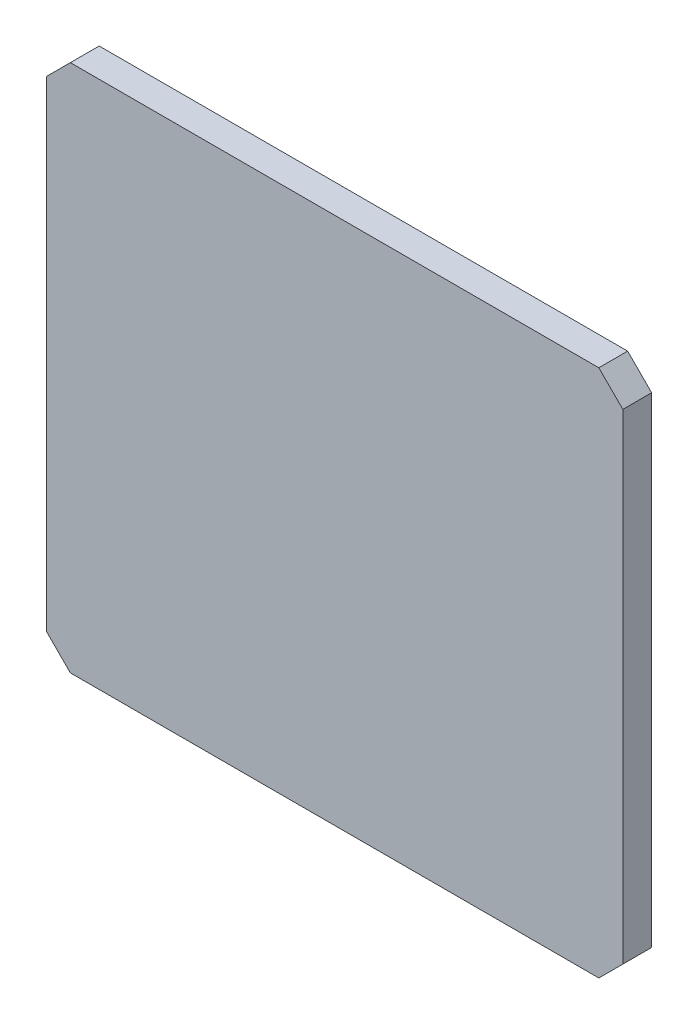
ISO-10303-21;
HEADER;
FILE_DESCRIPTION(('STEP AP214'),'2;1');
FILE_NAME('part.step','',(''),(''),'','','');
FILE_SCHEMA(('AUTOMOTIVE_DESIGN { 1 0 10303 214 1 1 1 1 }'));
ENDSEC;
DATA;
#1=APPLICATION_CONTEXT('core data for automotive mechanical design processes');
#2=APPLICATION_PROTOCOL_DEFINITION('international standard','automotive_design',2000,#1);
#3=PRODUCT_CONTEXT('',#1,'mechanical');
#4=PRODUCT('Part','Part','',(#3));
#5=PRODUCT_RELATED_PRODUCT_CATEGORY('part','',(#4));
#6=PRODUCT_DEFINITION_FORMATION('','',#4);
#7=PRODUCT_DEFINITION_CONTEXT('part definition',#1,'design');
#8=PRODUCT_DEFINITION('design','',#6,#7);
#9=PRODUCT_DEFINITION_SHAPE('','',#8);
#10=(LENGTH_UNIT() NAMED_UNIT(*) SI_UNIT(.MILLI.,.METRE.));
#11=(NAMED_UNIT(*) PLANE_ANGLE_UNIT() SI_UNIT($,.RADIAN.));
#12=(NAMED_UNIT(*) SI_UNIT($,.STERADIAN.) SOLID_ANGLE_UNIT());
#13=UNCERTAINTY_MEASURE_WITH_UNIT(LENGTH_MEASURE(1.E-05),#10,'distance_accuracy_value','');
#14=(GEOMETRIC_REPRESENTATION_CONTEXT(3) GLOBAL_UNCERTAINTY_ASSIGNED_CONTEXT((#13)) GLOBAL_UNIT_ASSIGNED_CONTEXT((#10,
#11,#12)) REPRESENTATION_CONTEXT('',''));
#15=CARTESIAN_POINT('',(0.,0.,0.));
#16=DIRECTION('',(0.,0.,1.));
#17=DIRECTION('',(1.,0.,0.));
#18=AXIS2_PLACEMENT_3D('',#15,#16,#17);
#19=CARTESIAN_POINT('',(-11.8671193399392,8.65417867435159,1.8));
#20=DIRECTION('',(1.,0.,0.));
#21=DIRECTION('',(0.,1.,0.));
#22=AXIS2_PLACEMENT_3D('',#19,#20,#21);
#23=PLANE('',#22);
#24=DIRECTION('',(0.,-1.,0.));
#25=VECTOR('',#24,1.);
#26=CARTESIAN_POINT('',(-11.8671193399392,8.65417867435159,0.));
#27=LINE('',#26,#25);
#28=CARTESIAN_POINT('',(-11.8671193399392,7.15417867435158,0.));
#29=VERTEX_POINT('',#28);
#30=CARTESIAN_POINT('',(-11.8671193399392,-22.8458213256484,0.));
#31=VERTEX_POINT('',#30);
#32=EDGE_CURVE('E130',#29,#31,#27,.T.);
#33=ORIENTED_EDGE('',*,*,#32,.T.);
#34=DIRECTION('',(0.,0.,1.));
#35=VECTOR('',#34,1.);
#36=CARTESIAN_POINT('',(-11.8671193399392,-22.8458213256484,1.8));
#37=LINE('',#36,#35);
#38=CARTESIAN_POINT('',(-11.8671193399392,-22.8458213256484,1.8));
#39=VERTEX_POINT('',#38);
#40=EDGE_CURVE('E152',#31,#39,#37,.T.);
#41=ORIENTED_EDGE('',*,*,#40,.T.);
#42=DIRECTION('',(0.,-1.,0.));
#43=VECTOR('',#42,1.);
#44=CARTESIAN_POINT('',(-11.8671193399392,8.65417867435159,1.8));
#45=LINE('',#44,#43);
#46=CARTESIAN_POINT('',(-11.8671193399392,7.15417867435158,1.8));
#47=VERTEX_POINT('',#46);
#48=EDGE_CURVE('E128',#47,#39,#45,.T.);
#49=ORIENTED_EDGE('',*,*,#48,.F.);
#50=DIRECTION('',(0.,0.,-1.));
#51=VECTOR('',#50,1.);
#52=CARTESIAN_POINT('',(-11.8671193399392,7.15417867435158,1.8));
#53=LINE('',#52,#51);
#54=EDGE_CURVE('E149',#47,#29,#53,.T.);
#55=ORIENTED_EDGE('',*,*,#54,.T.);
#56=EDGE_LOOP('',(#33,#41,#49,#55));
#57=FACE_BOUND('',#56,.T.);
#58=ADVANCED_FACE('F33',(#57),#23,.F.);
#59=CARTESIAN_POINT('',(-11.8671193399392,-24.3458213256484,1.8));
#60=DIRECTION('',(0.,1.,0.));
#61=DIRECTION('',(0.,0.,1.));
#62=AXIS2_PLACEMENT_3D('',#59,#60,#61);
#63=PLANE('',#62);
#64=DIRECTION('',(1.,0.,0.));
#65=VECTOR('',#64,1.);
#66=CARTESIAN_POINT('',(-11.8671193399392,-24.3458213256484,0.));
#67=LINE('',#66,#65);
#68=CARTESIAN_POINT('',(-10.3671193399392,-24.3458213256484,0.));
#69=VERTEX_POINT('',#68);
#70=CARTESIAN_POINT('',(22.6328806600608,-24.3458213256484,0.));
#71=VERTEX_POINT('',#70);
#72=EDGE_CURVE('E126',#69,#71,#67,.T.);
#73=ORIENTED_EDGE('',*,*,#72,.T.);
#74=DIRECTION('',(0.,0.,1.));
#75=VECTOR('',#74,1.);
#76=CARTESIAN_POINT('',(22.6328806600608,-24.3458213256484,1.8));
#77=LINE('',#76,#75);
#78=CARTESIAN_POINT('',(22.6328806600608,-24.3458213256484,1.8));
#79=VERTEX_POINT('',#78);
#80=EDGE_CURVE('E104',#71,#79,#77,.T.);
#81=ORIENTED_EDGE('',*,*,#80,.T.);
#82=DIRECTION('',(1.,0.,0.));
#83=VECTOR('',#82,1.);
#84=CARTESIAN_POINT('',(-11.8671193399392,-24.3458213256484,1.8));
#85=LINE('',#84,#83);
#86=CARTESIAN_POINT('',(-10.3671193399392,-24.3458213256484,1.8));
#87=VERTEX_POINT('',#86);
#88=EDGE_CURVE('E166',#87,#79,#85,.T.);
#89=ORIENTED_EDGE('',*,*,#88,.F.);
#90=DIRECTION('',(0.,0.,-1.));
#91=VECTOR('',#90,1.);
#92=CARTESIAN_POINT('',(-10.3671193399392,-24.3458213256484,1.8));
#93=LINE('',#92,#91);
#94=EDGE_CURVE('E109',#87,#69,#93,.T.);
#95=ORIENTED_EDGE('',*,*,#94,.T.);
#96=EDGE_LOOP('',(#73,#81,#89,#95));
#97=FACE_BOUND('',#96,.T.);
#98=ADVANCED_FACE('F171',(#97),#63,.F.);
#99=CARTESIAN_POINT('',(24.1328806600608,8.65417867435159,1.8));
#100=DIRECTION('',(-1.,0.,0.));
#101=DIRECTION('',(0.,-1.,0.));
#102=AXIS2_PLACEMENT_3D('',#99,#100,#101);
#103=PLANE('',#102);
#104=DIRECTION('',(0.,1.,0.));
#105=VECTOR('',#104,1.);
#106=CARTESIAN_POINT('',(24.1328806600608,8.65417867435159,1.8));
#107=LINE('',#106,#105);
#108=CARTESIAN_POINT('',(24.1328806600608,-22.8458213256484,1.8));
#109=VERTEX_POINT('',#108);
#110=CARTESIAN_POINT('',(24.1328806600608,7.15417867435157,1.8));
#111=VERTEX_POINT('',#110);
#112=EDGE_CURVE('E118',#109,#111,#107,.T.);
#113=ORIENTED_EDGE('',*,*,#112,.F.);
#114=DIRECTION('',(0.,0.,-1.));
#115=VECTOR('',#114,1.);
#116=CARTESIAN_POINT('',(24.1328806600608,-22.8458213256484,1.8));
#117=LINE('',#116,#115);
#118=CARTESIAN_POINT('',(24.1328806600608,-22.8458213256484,0.));
#119=VERTEX_POINT('',#118);
#120=EDGE_CURVE('E103',#109,#119,#117,.T.);
#121=ORIENTED_EDGE('',*,*,#120,.T.);
#122=DIRECTION('',(0.,1.,0.));
#123=VECTOR('',#122,1.);
#124=CARTESIAN_POINT('',(24.1328806600608,8.65417867435159,0.));
#125=LINE('',#124,#123);
#126=CARTESIAN_POINT('',(24.1328806600608,7.15417867435157,0.));
#127=VERTEX_POINT('',#126);
#128=EDGE_CURVE('E116',#119,#127,#125,.T.);
#129=ORIENTED_EDGE('',*,*,#128,.T.);
#130=DIRECTION('',(0.,0.,1.));
#131=VECTOR('',#130,1.);
#132=CARTESIAN_POINT('',(24.1328806600608,7.15417867435157,1.8));
#133=LINE('',#132,#131);
#134=EDGE_CURVE('E120',#127,#111,#133,.T.);
#135=ORIENTED_EDGE('',*,*,#134,.T.);
#136=EDGE_LOOP('',(#113,#121,#129,#135));
#137=FACE_BOUND('',#136,.T.);
#138=ADVANCED_FACE('F115',(#137),#103,.F.);
#139=CARTESIAN_POINT('',(-11.8671193399392,8.65417867435159,1.8));
#140=DIRECTION('',(0.,-1.,0.));
#141=DIRECTION('',(0.,0.,-1.));
#142=AXIS2_PLACEMENT_3D('',#139,#140,#141);
#143=PLANE('',#142);
#144=DIRECTION('',(-1.,0.,0.));
#145=VECTOR('',#144,1.);
#146=CARTESIAN_POINT('',(-11.8671193399392,8.65417867435159,1.8));
#147=LINE('',#146,#145);
#148=CARTESIAN_POINT('',(22.6328806600608,8.65417867435159,1.8));
#149=VERTEX_POINT('',#148);
#150=CARTESIAN_POINT('',(-10.3671193399392,8.65417867435159,1.8));
#151=VERTEX_POINT('',#150);
#152=EDGE_CURVE('E134',#149,#151,#147,.T.);
#153=ORIENTED_EDGE('',*,*,#152,.F.);
#154=DIRECTION('',(0.,0.,-1.));
#155=VECTOR('',#154,1.);
#156=CARTESIAN_POINT('',(22.6328806600608,8.65417867435159,1.8));
#157=LINE('',#156,#155);
#158=CARTESIAN_POINT('',(22.6328806600608,8.65417867435159,0.));
#159=VERTEX_POINT('',#158);
#160=EDGE_CURVE('E11',#149,#159,#157,.T.);
#161=ORIENTED_EDGE('',*,*,#160,.T.);
#162=DIRECTION('',(-1.,0.,0.));
#163=VECTOR('',#162,1.);
#164=CARTESIAN_POINT('',(-11.8671193399392,8.65417867435159,0.));
#165=LINE('',#164,#163);
#166=CARTESIAN_POINT('',(-10.3671193399392,8.65417867435159,0.));
#167=VERTEX_POINT('',#166);
#168=EDGE_CURVE('E125',#159,#167,#165,.T.);
#169=ORIENTED_EDGE('',*,*,#168,.T.);
#170=DIRECTION('',(0.,0.,1.));
#171=VECTOR('',#170,1.);
#172=CARTESIAN_POINT('',(-10.3671193399392,8.65417867435159,1.8));
#173=LINE('',#172,#171);
#174=EDGE_CURVE('E41',#167,#151,#173,.T.);
#175=ORIENTED_EDGE('',*,*,#174,.T.);
#176=EDGE_LOOP('',(#153,#161,#169,#175));
#177=FACE_BOUND('',#176,.T.);
#178=ADVANCED_FACE('F178',(#177),#143,.F.);
#179=CARTESIAN_POINT('',(0.,0.,1.8));
#180=DIRECTION('',(0.,0.,1.));
#181=DIRECTION('',(1.,0.,0.));
#182=AXIS2_PLACEMENT_3D('',#179,#180,#181);
#183=PLANE('',#182);
#184=ORIENTED_EDGE('',*,*,#88,.T.);
#185=DIRECTION('',(-0.707106781186548,-0.707106781186547,0.));
#186=VECTOR('',#185,1.);
#187=CARTESIAN_POINT('',(23.4893509928546,-23.4893509928546,1.8));
#188=LINE('',#187,#186);
#189=EDGE_CURVE('E147',#79,#109,#188,.F.);
#190=ORIENTED_EDGE('',*,*,#189,.T.);
#191=ORIENTED_EDGE('',*,*,#112,.T.);
#192=DIRECTION('',(0.707106781186548,-0.707106781186547,0.));
#193=VECTOR('',#192,1.);
#194=CARTESIAN_POINT('',(15.6435296672062,15.6435296672062,1.8));
#195=LINE('',#194,#193);
#196=EDGE_CURVE('E54',#111,#149,#195,.F.);
#197=ORIENTED_EDGE('',*,*,#196,.T.);
#198=ORIENTED_EDGE('',*,*,#152,.T.);
#199=DIRECTION('',(0.707106781186549,0.707106781186546,0.));
#200=VECTOR('',#199,1.);
#201=CARTESIAN_POINT('',(-9.51064900714536,9.5106490071454,1.8));
#202=LINE('',#201,#200);
#203=EDGE_CURVE('E142',#151,#47,#202,.F.);
#204=ORIENTED_EDGE('',*,*,#203,.T.);
#205=ORIENTED_EDGE('',*,*,#48,.T.);
#206=DIRECTION('',(-0.707106781186546,0.707106781186549,0.));
#207=VECTOR('',#206,1.);
#208=CARTESIAN_POINT('',(-17.3564703327938,-17.3564703327937,1.8));
#209=LINE('',#208,#207);
#210=EDGE_CURVE('E145',#39,#87,#209,.F.);
#211=ORIENTED_EDGE('',*,*,#210,.T.);
#212=EDGE_LOOP('',(#184,#190,#191,#197,#198,#204,#205,#211));
#213=FACE_BOUND('',#212,.T.);
#214=ADVANCED_FACE('F163',(#213),#183,.T.);
#215=CARTESIAN_POINT('',(0.,0.,0.));
#216=DIRECTION('',(0.,0.,1.));
#217=DIRECTION('',(1.,0.,0.));
#218=AXIS2_PLACEMENT_3D('',#215,#216,#217);
#219=PLANE('',#218);
#220=ORIENTED_EDGE('',*,*,#128,.F.);
#221=DIRECTION('',(0.707106781186548,0.707106781186547,0.));
#222=VECTOR('',#221,1.);
#223=CARTESIAN_POINT('',(24.1328806600608,-22.8458213256484,0.));
#224=LINE('',#223,#222);
#225=EDGE_CURVE('E99',#119,#71,#224,.F.);
#226=ORIENTED_EDGE('',*,*,#225,.T.);
#227=ORIENTED_EDGE('',*,*,#72,.F.);
#228=DIRECTION('',(0.707106781186546,-0.707106781186549,0.));
#229=VECTOR('',#228,1.);
#230=CARTESIAN_POINT('',(-10.3671193399392,-24.3458213256484,0.));
#231=LINE('',#230,#229);
#232=EDGE_CURVE('E110',#69,#31,#231,.F.);
#233=ORIENTED_EDGE('',*,*,#232,.T.);
#234=ORIENTED_EDGE('',*,*,#32,.F.);
#235=DIRECTION('',(-0.707106781186549,-0.707106781186546,0.));
#236=VECTOR('',#235,1.);
#237=CARTESIAN_POINT('',(-11.8671193399392,7.15417867435158,0.));
#238=LINE('',#237,#236);
#239=EDGE_CURVE('E119',#29,#167,#238,.F.);
#240=ORIENTED_EDGE('',*,*,#239,.T.);
#241=ORIENTED_EDGE('',*,*,#168,.F.);
#242=DIRECTION('',(-0.707106781186548,0.707106781186547,0.));
#243=VECTOR('',#242,1.);
#244=CARTESIAN_POINT('',(22.6328806600608,8.65417867435159,0.));
#245=LINE('',#244,#243);
#246=EDGE_CURVE('E124',#159,#127,#245,.F.);
#247=ORIENTED_EDGE('',*,*,#246,.T.);
#248=EDGE_LOOP('',(#220,#226,#227,#233,#234,#240,#241,#247));
#249=FACE_BOUND('',#248,.T.);
#250=ADVANCED_FACE('F122',(#249),#219,.F.);
#251=CARTESIAN_POINT('',(24.1328806600608,-22.8458213256484,1.8));
#252=DIRECTION('',(-0.707106781186547,0.707106781186548,0.));
#253=DIRECTION('',(0.,0.,-1.));
#254=AXIS2_PLACEMENT_3D('',#251,#252,#253);
#255=PLANE('',#254);
#256=ORIENTED_EDGE('',*,*,#189,.F.);
#257=ORIENTED_EDGE('',*,*,#80,.F.);
#258=ORIENTED_EDGE('',*,*,#225,.F.);
#259=ORIENTED_EDGE('',*,*,#120,.F.);
#260=EDGE_LOOP('',(#256,#257,#258,#259));
#261=FACE_BOUND('',#260,.T.);
#262=ADVANCED_FACE('F102',(#261),#255,.F.);
#263=CARTESIAN_POINT('',(-10.3671193399392,-24.3458213256484,1.8));
#264=DIRECTION('',(0.707106781186549,0.707106781186546,0.));
#265=DIRECTION('',(0.,0.,-1.));
#266=AXIS2_PLACEMENT_3D('',#263,#264,#265);
#267=PLANE('',#266);
#268=ORIENTED_EDGE('',*,*,#210,.F.);
#269=ORIENTED_EDGE('',*,*,#40,.F.);
#270=ORIENTED_EDGE('',*,*,#232,.F.);
#271=ORIENTED_EDGE('',*,*,#94,.F.);
#272=EDGE_LOOP('',(#268,#269,#270,#271));
#273=FACE_BOUND('',#272,.T.);
#274=ADVANCED_FACE('F169',(#273),#267,.F.);
#275=CARTESIAN_POINT('',(22.6328806600608,8.65417867435159,1.8));
#276=DIRECTION('',(-0.707106781186547,-0.707106781186548,0.));
#277=DIRECTION('',(0.,0.,-1.));
#278=AXIS2_PLACEMENT_3D('',#275,#276,#277);
#279=PLANE('',#278);
#280=ORIENTED_EDGE('',*,*,#196,.F.);
#281=ORIENTED_EDGE('',*,*,#134,.F.);
#282=ORIENTED_EDGE('',*,*,#246,.F.);
#283=ORIENTED_EDGE('',*,*,#160,.F.);
#284=EDGE_LOOP('',(#280,#281,#282,#283));
#285=FACE_BOUND('',#284,.T.);
#286=ADVANCED_FACE('F177',(#285),#279,.F.);
#287=CARTESIAN_POINT('',(-11.8671193399392,7.15417867435158,1.8));
#288=DIRECTION('',(0.707106781186546,-0.707106781186549,0.));
#289=DIRECTION('',(0.,0.,-1.));
#290=AXIS2_PLACEMENT_3D('',#287,#288,#289);
#291=PLANE('',#290);
#292=ORIENTED_EDGE('',*,*,#203,.F.);
#293=ORIENTED_EDGE('',*,*,#174,.F.);
#294=ORIENTED_EDGE('',*,*,#239,.F.);
#295=ORIENTED_EDGE('',*,*,#54,.F.);
#296=EDGE_LOOP('',(#292,#293,#294,#295));
#297=FACE_BOUND('',#296,.T.);
#298=ADVANCED_FACE('F35',(#297),#291,.F.);
#299=CLOSED_SHELL('',(#58,#98,#138,#178,#214,#250,#262,#274,#286,#298));
#300=MANIFOLD_SOLID_BREP('B2',#299);
#301=ADVANCED_BREP_SHAPE_REPRESENTATION('',(#18,#300),#14);
#302=SHAPE_DEFINITION_REPRESENTATION(#9,#301);
ENDSEC;
END-ISO-10303-21;
